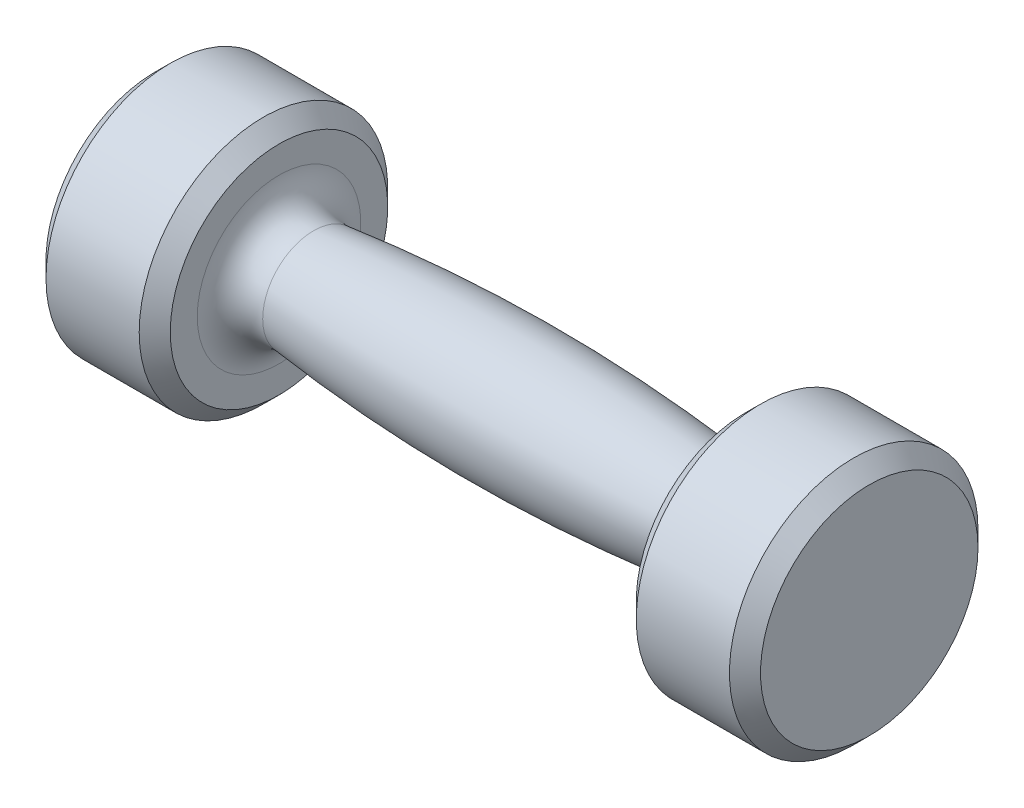
ISO-10303-21;
HEADER;
FILE_DESCRIPTION(('STEP AP214'),'2;1');
FILE_NAME('part.step','',(''),(''),'','','');
FILE_SCHEMA(('AUTOMOTIVE_DESIGN { 1 0 10303 214 1 1 1 1 }'));
ENDSEC;
DATA;
#1=APPLICATION_CONTEXT('core data for automotive mechanical design processes');
#2=APPLICATION_PROTOCOL_DEFINITION('international standard','automotive_design',2000,#1);
#3=PRODUCT_CONTEXT('',#1,'mechanical');
#4=PRODUCT('Part','Part','',(#3));
#5=PRODUCT_RELATED_PRODUCT_CATEGORY('part','',(#4));
#6=PRODUCT_DEFINITION_FORMATION('','',#4);
#7=PRODUCT_DEFINITION_CONTEXT('part definition',#1,'design');
#8=PRODUCT_DEFINITION('design','',#6,#7);
#9=PRODUCT_DEFINITION_SHAPE('','',#8);
#10=(LENGTH_UNIT() NAMED_UNIT(*) SI_UNIT(.MILLI.,.METRE.));
#11=(NAMED_UNIT(*) PLANE_ANGLE_UNIT() SI_UNIT($,.RADIAN.));
#12=(NAMED_UNIT(*) SI_UNIT($,.STERADIAN.) SOLID_ANGLE_UNIT());
#13=UNCERTAINTY_MEASURE_WITH_UNIT(LENGTH_MEASURE(1.E-05),#10,'distance_accuracy_value','');
#14=(GEOMETRIC_REPRESENTATION_CONTEXT(3) GLOBAL_UNCERTAINTY_ASSIGNED_CONTEXT((#13)) GLOBAL_UNIT_ASSIGNED_CONTEXT((#10,
#11,#12)) REPRESENTATION_CONTEXT('',''));
#15=CARTESIAN_POINT('',(0.,0.,0.));
#16=DIRECTION('',(0.,0.,1.));
#17=DIRECTION('',(1.,0.,0.));
#18=AXIS2_PLACEMENT_3D('',#15,#16,#17);
#19=CARTESIAN_POINT('',(75.,0.,0.));
#20=DIRECTION('',(1.,0.,0.));
#21=DIRECTION('',(0.,0.,-1.));
#22=AXIS2_PLACEMENT_3D('',#19,#20,#21);
#23=CYLINDRICAL_SURFACE('',#22,40.);
#24=CARTESIAN_POINT('',(110.,0.,0.));
#25=DIRECTION('',(1.,0.,0.));
#26=DIRECTION('',(0.,0.,-1.));
#27=AXIS2_PLACEMENT_3D('',#24,#25,#26);
#28=CIRCLE('',#27,40.);
#29=CARTESIAN_POINT('',(110.,0.,-40.));
#30=VERTEX_POINT('',#29);
#31=EDGE_CURVE('E68',#30,#30,#28,.F.);
#32=ORIENTED_EDGE('',*,*,#31,.T.);
#33=EDGE_LOOP('',(#32));
#34=FACE_BOUND('',#33,.T.);
#35=CARTESIAN_POINT('',(80.,0.,0.));
#36=DIRECTION('',(1.,0.,0.));
#37=DIRECTION('',(0.,0.,-1.));
#38=AXIS2_PLACEMENT_3D('',#35,#36,#37);
#39=CIRCLE('',#38,40.);
#40=CARTESIAN_POINT('',(80.,0.,-40.));
#41=VERTEX_POINT('',#40);
#42=EDGE_CURVE('E71',#41,#41,#39,.T.);
#43=ORIENTED_EDGE('',*,*,#42,.T.);
#44=EDGE_LOOP('',(#43));
#45=FACE_BOUND('',#44,.T.);
#46=ADVANCED_FACE('F33',(#34,#45),#23,.T.);
#47=CARTESIAN_POINT('',(75.,0.,0.));
#48=DIRECTION('',(1.,0.,0.));
#49=DIRECTION('',(0.,0.,-1.));
#50=AXIS2_PLACEMENT_3D('',#47,#48,#49);
#51=PLANE('',#50);
#52=CARTESIAN_POINT('',(75.,0.,0.));
#53=DIRECTION('',(1.,0.,0.));
#54=DIRECTION('',(0.,0.,-1.));
#55=AXIS2_PLACEMENT_3D('',#52,#53,#54);
#56=CIRCLE('',#55,26.314274283428);
#57=CARTESIAN_POINT('',(75.,0.,-26.314274283428));
#58=VERTEX_POINT('',#57);
#59=EDGE_CURVE('E40',#58,#58,#56,.T.);
#60=ORIENTED_EDGE('',*,*,#59,.T.);
#61=EDGE_LOOP('',(#60));
#62=FACE_BOUND('',#61,.T.);
#63=CARTESIAN_POINT('',(75.,0.,0.));
#64=DIRECTION('',(1.,0.,0.));
#65=DIRECTION('',(0.,0.,-1.));
#66=AXIS2_PLACEMENT_3D('',#63,#64,#65);
#67=CIRCLE('',#66,35.);
#68=CARTESIAN_POINT('',(75.,0.,-35.));
#69=VERTEX_POINT('',#68);
#70=EDGE_CURVE('E65',#69,#69,#67,.F.);
#71=ORIENTED_EDGE('',*,*,#70,.T.);
#72=EDGE_LOOP('',(#71));
#73=FACE_BOUND('',#72,.T.);
#74=ADVANCED_FACE('F99',(#62,#73),#51,.F.);
#75=CARTESIAN_POINT('',(115.,0.,0.));
#76=DIRECTION('',(1.,0.,0.));
#77=DIRECTION('',(0.,0.,-1.));
#78=AXIS2_PLACEMENT_3D('',#75,#76,#77);
#79=PLANE('',#78);
#80=CARTESIAN_POINT('',(115.,0.,0.));
#81=DIRECTION('',(1.,0.,0.));
#82=DIRECTION('',(0.,0.,-1.));
#83=AXIS2_PLACEMENT_3D('',#80,#81,#82);
#84=CIRCLE('',#83,35.);
#85=CARTESIAN_POINT('',(115.,0.,-35.));
#86=VERTEX_POINT('',#85);
#87=EDGE_CURVE('E74',#86,#86,#84,.T.);
#88=ORIENTED_EDGE('',*,*,#87,.T.);
#89=EDGE_LOOP('',(#88));
#90=FACE_BOUND('',#89,.T.);
#91=ADVANCED_FACE('F78',(#90),#79,.T.);
#92=CARTESIAN_POINT('',(0.,0.,0.));
#93=DIRECTION('',(-1.,0.,0.));
#94=DIRECTION('',(0.,0.,1.));
#95=AXIS2_PLACEMENT_3D('',#92,#93,#94);
#96=DEGENERATE_TOROIDAL_SURFACE('',#95,545.,565.,.F.);
#97=CARTESIAN_POINT('',(63.8695652173913,0.,0.));
#98=DIRECTION('',(-1.,0.,0.));
#99=DIRECTION('',(0.,0.,1.));
#100=AXIS2_PLACEMENT_3D('',#97,#98,#99);
#101=CIRCLE('',#100,16.3783738611075);
#102=CARTESIAN_POINT('',(63.8695652173913,0.,16.3783738611075));
#103=VERTEX_POINT('',#102);
#104=EDGE_CURVE('E44',#103,#103,#101,.T.);
#105=ORIENTED_EDGE('',*,*,#104,.T.);
#106=EDGE_LOOP('',(#105));
#107=FACE_BOUND('',#106,.T.);
#108=CARTESIAN_POINT('',(-63.8695652173913,0.,0.));
#109=DIRECTION('',(1.,0.,0.));
#110=DIRECTION('',(0.,0.,-1.));
#111=AXIS2_PLACEMENT_3D('',#108,#109,#110);
#112=CIRCLE('',#111,16.3783738611075);
#113=CARTESIAN_POINT('',(-63.8695652173913,0.,-16.3783738611075));
#114=VERTEX_POINT('',#113);
#115=EDGE_CURVE('E48',#114,#114,#112,.T.);
#116=ORIENTED_EDGE('',*,*,#115,.T.);
#117=EDGE_LOOP('',(#116));
#118=FACE_BOUND('',#117,.T.);
#119=ADVANCED_FACE('F110',(#107,#118),#96,.F.);
#120=CARTESIAN_POINT('',(-115.,0.,0.));
#121=DIRECTION('',(1.,0.,0.));
#122=DIRECTION('',(0.,0.,-1.));
#123=AXIS2_PLACEMENT_3D('',#120,#121,#122);
#124=PLANE('',#123);
#125=CARTESIAN_POINT('',(-115.,0.,0.));
#126=DIRECTION('',(1.,0.,0.));
#127=DIRECTION('',(0.,0.,-1.));
#128=AXIS2_PLACEMENT_3D('',#125,#126,#127);
#129=CIRCLE('',#128,35.);
#130=CARTESIAN_POINT('',(-115.,0.,-35.));
#131=VERTEX_POINT('',#130);
#132=EDGE_CURVE('E53',#131,#131,#129,.F.);
#133=ORIENTED_EDGE('',*,*,#132,.T.);
#134=EDGE_LOOP('',(#133));
#135=FACE_BOUND('',#134,.T.);
#136=ADVANCED_FACE('F111',(#135),#124,.F.);
#137=CARTESIAN_POINT('',(-75.,0.,0.));
#138=DIRECTION('',(-1.,0.,0.));
#139=DIRECTION('',(0.,0.,1.));
#140=AXIS2_PLACEMENT_3D('',#137,#138,#139);
#141=CYLINDRICAL_SURFACE('',#140,40.);
#142=CARTESIAN_POINT('',(-80.,0.,0.));
#143=DIRECTION('',(-1.,0.,0.));
#144=DIRECTION('',(0.,0.,1.));
#145=AXIS2_PLACEMENT_3D('',#142,#143,#144);
#146=CIRCLE('',#145,40.);
#147=CARTESIAN_POINT('',(-80.,0.,40.));
#148=VERTEX_POINT('',#147);
#149=EDGE_CURVE('E59',#148,#148,#146,.T.);
#150=ORIENTED_EDGE('',*,*,#149,.T.);
#151=EDGE_LOOP('',(#150));
#152=FACE_BOUND('',#151,.T.);
#153=CARTESIAN_POINT('',(-110.,0.,0.));
#154=DIRECTION('',(1.,0.,0.));
#155=DIRECTION('',(0.,0.,-1.));
#156=AXIS2_PLACEMENT_3D('',#153,#154,#155);
#157=CIRCLE('',#156,40.);
#158=CARTESIAN_POINT('',(-110.,0.,-40.));
#159=VERTEX_POINT('',#158);
#160=EDGE_CURVE('E62',#159,#159,#157,.T.);
#161=ORIENTED_EDGE('',*,*,#160,.T.);
#162=EDGE_LOOP('',(#161));
#163=FACE_BOUND('',#162,.T.);
#164=ADVANCED_FACE('F93',(#152,#163),#141,.T.);
#165=CARTESIAN_POINT('',(-75.,0.,0.));
#166=DIRECTION('',(-1.,0.,0.));
#167=DIRECTION('',(0.,0.,1.));
#168=AXIS2_PLACEMENT_3D('',#165,#166,#167);
#169=PLANE('',#168);
#170=CARTESIAN_POINT('',(-75.,0.,0.));
#171=DIRECTION('',(-1.,0.,0.));
#172=DIRECTION('',(0.,0.,1.));
#173=AXIS2_PLACEMENT_3D('',#170,#171,#172);
#174=CIRCLE('',#173,26.314274283428);
#175=CARTESIAN_POINT('',(-75.,0.,26.314274283428));
#176=VERTEX_POINT('',#175);
#177=EDGE_CURVE('E10',#176,#176,#174,.T.);
#178=ORIENTED_EDGE('',*,*,#177,.T.);
#179=EDGE_LOOP('',(#178));
#180=FACE_BOUND('',#179,.T.);
#181=CARTESIAN_POINT('',(-75.,0.,0.));
#182=DIRECTION('',(-1.,0.,0.));
#183=DIRECTION('',(0.,0.,1.));
#184=AXIS2_PLACEMENT_3D('',#181,#182,#183);
#185=CIRCLE('',#184,35.);
#186=CARTESIAN_POINT('',(-75.,0.,35.));
#187=VERTEX_POINT('',#186);
#188=EDGE_CURVE('E56',#187,#187,#185,.F.);
#189=ORIENTED_EDGE('',*,*,#188,.T.);
#190=EDGE_LOOP('',(#189));
#191=FACE_BOUND('',#190,.T.);
#192=ADVANCED_FACE('F83',(#180,#191),#169,.F.);
#193=CARTESIAN_POINT('',(115.,0.,0.));
#194=DIRECTION('',(-1.,0.,0.));
#195=DIRECTION('',(0.,0.,1.));
#196=AXIS2_PLACEMENT_3D('',#193,#194,#195);
#197=CONICAL_SURFACE('',#196,35.,0.785398163397446);
#198=ORIENTED_EDGE('',*,*,#31,.F.);
#199=EDGE_LOOP('',(#198));
#200=FACE_BOUND('',#199,.T.);
#201=ORIENTED_EDGE('',*,*,#87,.F.);
#202=EDGE_LOOP('',(#201));
#203=FACE_BOUND('',#202,.T.);
#204=ADVANCED_FACE('F80',(#200,#203),#197,.T.);
#205=CARTESIAN_POINT('',(80.,0.,0.));
#206=DIRECTION('',(1.,0.,0.));
#207=DIRECTION('',(0.,0.,-1.));
#208=AXIS2_PLACEMENT_3D('',#205,#206,#207);
#209=CONICAL_SURFACE('',#208,40.,0.785398163397449);
#210=ORIENTED_EDGE('',*,*,#70,.F.);
#211=EDGE_LOOP('',(#210));
#212=FACE_BOUND('',#211,.T.);
#213=ORIENTED_EDGE('',*,*,#42,.F.);
#214=EDGE_LOOP('',(#213));
#215=FACE_BOUND('',#214,.T.);
#216=ADVANCED_FACE('F82',(#212,#215),#209,.T.);
#217=CARTESIAN_POINT('',(-80.,0.,0.));
#218=DIRECTION('',(-1.,0.,0.));
#219=DIRECTION('',(0.,0.,1.));
#220=AXIS2_PLACEMENT_3D('',#217,#218,#219);
#221=CONICAL_SURFACE('',#220,40.,0.785398163397449);
#222=ORIENTED_EDGE('',*,*,#188,.F.);
#223=EDGE_LOOP('',(#222));
#224=FACE_BOUND('',#223,.T.);
#225=ORIENTED_EDGE('',*,*,#149,.F.);
#226=EDGE_LOOP('',(#225));
#227=FACE_BOUND('',#226,.T.);
#228=ADVANCED_FACE('F90',(#224,#227),#221,.T.);
#229=CARTESIAN_POINT('',(-115.,0.,0.));
#230=DIRECTION('',(1.,0.,0.));
#231=DIRECTION('',(0.,0.,-1.));
#232=AXIS2_PLACEMENT_3D('',#229,#230,#231);
#233=CONICAL_SURFACE('',#232,35.,0.785398163397446);
#234=ORIENTED_EDGE('',*,*,#160,.F.);
#235=EDGE_LOOP('',(#234));
#236=FACE_BOUND('',#235,.T.);
#237=ORIENTED_EDGE('',*,*,#132,.F.);
#238=EDGE_LOOP('',(#237));
#239=FACE_BOUND('',#238,.T.);
#240=ADVANCED_FACE('F123',(#236,#239),#233,.T.);
#241=CARTESIAN_POINT('',(65.,0.,0.));
#242=DIRECTION('',(1.,0.,0.));
#243=DIRECTION('',(0.,0.,-1.));
#244=AXIS2_PLACEMENT_3D('',#241,#242,#243);
#245=TOROIDAL_SURFACE('',#244,26.314274283428,10.);
#246=ORIENTED_EDGE('',*,*,#59,.F.);
#247=EDGE_LOOP('',(#246));
#248=FACE_BOUND('',#247,.T.);
#249=ORIENTED_EDGE('',*,*,#104,.F.);
#250=EDGE_LOOP('',(#249));
#251=FACE_BOUND('',#250,.T.);
#252=ADVANCED_FACE('F125',(#248,#251),#245,.F.);
#253=CARTESIAN_POINT('',(-65.,0.,0.));
#254=DIRECTION('',(-1.,0.,0.));
#255=DIRECTION('',(0.,0.,1.));
#256=AXIS2_PLACEMENT_3D('',#253,#254,#255);
#257=TOROIDAL_SURFACE('',#256,26.314274283428,10.);
#258=ORIENTED_EDGE('',*,*,#115,.F.);
#259=EDGE_LOOP('',(#258));
#260=FACE_BOUND('',#259,.T.);
#261=ORIENTED_EDGE('',*,*,#177,.F.);
#262=EDGE_LOOP('',(#261));
#263=FACE_BOUND('',#262,.T.);
#264=ADVANCED_FACE('F35',(#260,#263),#257,.F.);
#265=CLOSED_SHELL('',(#46,#74,#91,#119,#136,#164,#192,#204,#216,#228,#240,#252,#264));
#266=MANIFOLD_SOLID_BREP('B2',#265);
#267=ADVANCED_BREP_SHAPE_REPRESENTATION('',(#18,#266),#14);
#268=SHAPE_DEFINITION_REPRESENTATION(#9,#267);
ENDSEC;
END-ISO-10303-21;
